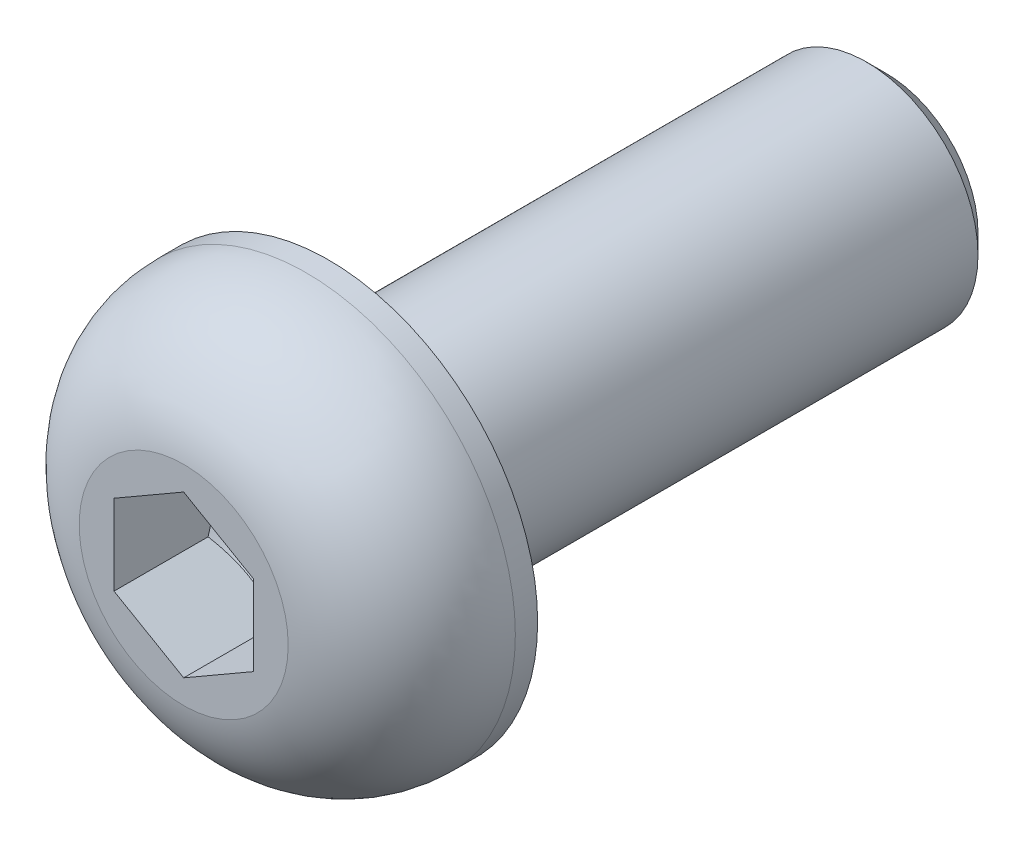
ISO-10303-21;
HEADER;
FILE_DESCRIPTION(('STEP AP214'),'2;1');
FILE_NAME('part.step','',(''),(''),'','','');
FILE_SCHEMA(('AUTOMOTIVE_DESIGN { 1 0 10303 214 1 1 1 1 }'));
ENDSEC;
DATA;
#1=APPLICATION_CONTEXT('core data for automotive mechanical design processes');
#2=APPLICATION_PROTOCOL_DEFINITION('international standard','automotive_design',2000,#1);
#3=PRODUCT_CONTEXT('',#1,'mechanical');
#4=PRODUCT('Part','Part','',(#3));
#5=PRODUCT_RELATED_PRODUCT_CATEGORY('part','',(#4));
#6=PRODUCT_DEFINITION_FORMATION('','',#4);
#7=PRODUCT_DEFINITION_CONTEXT('part definition',#1,'design');
#8=PRODUCT_DEFINITION('design','',#6,#7);
#9=PRODUCT_DEFINITION_SHAPE('','',#8);
#10=(LENGTH_UNIT() NAMED_UNIT(*) SI_UNIT(.MILLI.,.METRE.));
#11=(NAMED_UNIT(*) PLANE_ANGLE_UNIT() SI_UNIT($,.RADIAN.));
#12=(NAMED_UNIT(*) SI_UNIT($,.STERADIAN.) SOLID_ANGLE_UNIT());
#13=UNCERTAINTY_MEASURE_WITH_UNIT(LENGTH_MEASURE(1.E-05),#10,'distance_accuracy_value','');
#14=(GEOMETRIC_REPRESENTATION_CONTEXT(3) GLOBAL_UNCERTAINTY_ASSIGNED_CONTEXT((#13)) GLOBAL_UNIT_ASSIGNED_CONTEXT((#10,
#11,#12)) REPRESENTATION_CONTEXT('',''));
#15=CARTESIAN_POINT('',(0.,0.,0.));
#16=DIRECTION('',(0.,0.,1.));
#17=DIRECTION('',(1.,0.,0.));
#18=AXIS2_PLACEMENT_3D('',#15,#16,#17);
#19=CARTESIAN_POINT('',(0.,1.875,2.6));
#20=DIRECTION('',(0.,0.,-1.));
#21=DIRECTION('',(-1.,0.,0.));
#22=AXIS2_PLACEMENT_3D('',#19,#20,#21);
#23=PLANE('',#22);
#24=CARTESIAN_POINT('',(0.,0.,2.6));
#25=DIRECTION('',(0.,0.,1.));
#26=DIRECTION('',(1.,0.,0.));
#27=AXIS2_PLACEMENT_3D('',#24,#25,#26);
#28=CIRCLE('',#27,1.875);
#29=CARTESIAN_POINT('',(1.875,0.,2.6));
#30=VERTEX_POINT('',#29);
#31=EDGE_CURVE('E141',#30,#30,#28,.T.);
#32=ORIENTED_EDGE('',*,*,#31,.T.);
#33=EDGE_LOOP('',(#32));
#34=FACE_BOUND('',#33,.T.);
#35=DIRECTION('',(-0.866025403784438,-0.5,0.));
#36=VECTOR('',#35,1.);
#37=CARTESIAN_POINT('',(0.,1.44337567297406,2.6));
#38=LINE('',#37,#36);
#39=CARTESIAN_POINT('',(0.,1.44337567297406,2.6));
#40=VERTEX_POINT('',#39);
#41=CARTESIAN_POINT('',(-1.25,0.721687836487031,2.6));
#42=VERTEX_POINT('',#41);
#43=EDGE_CURVE('E93',#40,#42,#38,.T.);
#44=ORIENTED_EDGE('',*,*,#43,.F.);
#45=DIRECTION('',(-0.866025403784439,0.5,0.));
#46=VECTOR('',#45,1.);
#47=CARTESIAN_POINT('',(1.25,0.721687836487032,2.6));
#48=LINE('',#47,#46);
#49=CARTESIAN_POINT('',(1.25,0.721687836487032,2.6));
#50=VERTEX_POINT('',#49);
#51=EDGE_CURVE('E53',#50,#40,#48,.T.);
#52=ORIENTED_EDGE('',*,*,#51,.F.);
#53=DIRECTION('',(0.,1.,0.));
#54=VECTOR('',#53,1.);
#55=CARTESIAN_POINT('',(1.25,-0.721687836487032,2.6));
#56=LINE('',#55,#54);
#57=CARTESIAN_POINT('',(1.25,-0.721687836487032,2.6));
#58=VERTEX_POINT('',#57);
#59=EDGE_CURVE('E121',#58,#50,#56,.T.);
#60=ORIENTED_EDGE('',*,*,#59,.F.);
#61=DIRECTION('',(0.866025403784438,0.5,0.));
#62=VECTOR('',#61,1.);
#63=CARTESIAN_POINT('',(0.,-1.44337567297406,2.6));
#64=LINE('',#63,#62);
#65=CARTESIAN_POINT('',(0.,-1.44337567297406,2.6));
#66=VERTEX_POINT('',#65);
#67=EDGE_CURVE('E115',#66,#58,#64,.T.);
#68=ORIENTED_EDGE('',*,*,#67,.F.);
#69=DIRECTION('',(0.866025403784439,-0.5,0.));
#70=VECTOR('',#69,1.);
#71=CARTESIAN_POINT('',(-1.25,-0.721687836487031,2.6));
#72=LINE('',#71,#70);
#73=CARTESIAN_POINT('',(-1.25,-0.721687836487031,2.6));
#74=VERTEX_POINT('',#73);
#75=EDGE_CURVE('E113',#74,#66,#72,.T.);
#76=ORIENTED_EDGE('',*,*,#75,.F.);
#77=DIRECTION('',(0.,-1.,0.));
#78=VECTOR('',#77,1.);
#79=CARTESIAN_POINT('',(-1.25,0.721687836487031,2.6));
#80=LINE('',#79,#78);
#81=EDGE_CURVE('E101',#42,#74,#80,.T.);
#82=ORIENTED_EDGE('',*,*,#81,.F.);
#83=EDGE_LOOP('',(#44,#52,#60,#68,#76,#82));
#84=FACE_BOUND('',#83,.T.);
#85=ADVANCED_FACE('F38',(#34,#84),#23,.F.);
#86=CARTESIAN_POINT('',(0.,0.,-10.));
#87=DIRECTION('',(0.,0.,1.));
#88=DIRECTION('',(1.,0.,0.));
#89=AXIS2_PLACEMENT_3D('',#86,#87,#88);
#90=PLANE('',#89);
#91=CARTESIAN_POINT('',(0.,0.,-10.));
#92=DIRECTION('',(0.,0.,1.));
#93=DIRECTION('',(1.,0.,0.));
#94=AXIS2_PLACEMENT_3D('',#91,#92,#93);
#95=CIRCLE('',#94,1.64999999999999);
#96=CARTESIAN_POINT('',(1.64999999999999,0.,-10.));
#97=VERTEX_POINT('',#96);
#98=EDGE_CURVE('E232',#97,#97,#95,.F.);
#99=ORIENTED_EDGE('',*,*,#98,.T.);
#100=EDGE_LOOP('',(#99));
#101=FACE_BOUND('',#100,.T.);
#102=ADVANCED_FACE('F210',(#101),#90,.F.);
#103=CARTESIAN_POINT('',(0.,0.,30.8099697885196));
#104=DIRECTION('',(0.,0.,1.));
#105=DIRECTION('',(1.,0.,0.));
#106=AXIS2_PLACEMENT_3D('',#103,#104,#105);
#107=CYLINDRICAL_SURFACE('',#106,2.);
#108=CARTESIAN_POINT('',(0.,0.,-0.199999999999999));
#109=DIRECTION('',(0.,0.,1.));
#110=DIRECTION('',(1.,0.,0.));
#111=AXIS2_PLACEMENT_3D('',#108,#109,#110);
#112=CIRCLE('',#111,2.);
#113=CARTESIAN_POINT('',(2.,0.,-0.199999999999999));
#114=VERTEX_POINT('',#113);
#115=EDGE_CURVE('E11',#114,#114,#112,.F.);
#116=ORIENTED_EDGE('',*,*,#115,.T.);
#117=EDGE_LOOP('',(#116));
#118=FACE_BOUND('',#117,.T.);
#119=CARTESIAN_POINT('',(0.,0.,-9.64999999999999));
#120=DIRECTION('',(0.,0.,1.));
#121=DIRECTION('',(1.,0.,0.));
#122=AXIS2_PLACEMENT_3D('',#119,#120,#121);
#123=CIRCLE('',#122,2.);
#124=CARTESIAN_POINT('',(2.,0.,-9.64999999999999));
#125=VERTEX_POINT('',#124);
#126=EDGE_CURVE('E227',#125,#125,#123,.T.);
#127=ORIENTED_EDGE('',*,*,#126,.T.);
#128=EDGE_LOOP('',(#127));
#129=FACE_BOUND('',#128,.T.);
#130=ADVANCED_FACE('F215',(#118,#129),#107,.T.);
#131=CARTESIAN_POINT('',(0.,2.,0.));
#132=DIRECTION('',(0.,0.,1.));
#133=DIRECTION('',(1.,0.,0.));
#134=AXIS2_PLACEMENT_3D('',#131,#132,#133);
#135=PLANE('',#134);
#136=CARTESIAN_POINT('',(0.,0.,0.));
#137=DIRECTION('',(0.,0.,1.));
#138=DIRECTION('',(1.,0.,0.));
#139=AXIS2_PLACEMENT_3D('',#136,#137,#138);
#140=CIRCLE('',#139,2.2);
#141=CARTESIAN_POINT('',(2.2,0.,0.));
#142=VERTEX_POINT('',#141);
#143=EDGE_CURVE('E46',#142,#142,#140,.T.);
#144=ORIENTED_EDGE('',*,*,#143,.T.);
#145=EDGE_LOOP('',(#144));
#146=FACE_BOUND('',#145,.T.);
#147=CARTESIAN_POINT('',(0.,0.,0.));
#148=DIRECTION('',(0.,0.,1.));
#149=DIRECTION('',(1.,0.,0.));
#150=AXIS2_PLACEMENT_3D('',#147,#148,#149);
#151=CIRCLE('',#150,3.75);
#152=CARTESIAN_POINT('',(3.75,0.,0.));
#153=VERTEX_POINT('',#152);
#154=EDGE_CURVE('E223',#153,#153,#151,.T.);
#155=ORIENTED_EDGE('',*,*,#154,.F.);
#156=EDGE_LOOP('',(#155));
#157=FACE_BOUND('',#156,.T.);
#158=ADVANCED_FACE('F237',(#146,#157),#135,.F.);
#159=CARTESIAN_POINT('',(0.,0.,30.8099697885196));
#160=DIRECTION('',(0.,0.,1.));
#161=DIRECTION('',(1.,0.,0.));
#162=AXIS2_PLACEMENT_3D('',#159,#160,#161);
#163=CYLINDRICAL_SURFACE('',#162,3.75);
#164=CARTESIAN_POINT('',(0.,0.,0.400000000000001));
#165=DIRECTION('',(0.,0.,1.));
#166=DIRECTION('',(1.,0.,0.));
#167=AXIS2_PLACEMENT_3D('',#164,#165,#166);
#168=CIRCLE('',#167,3.75);
#169=CARTESIAN_POINT('',(3.75,0.,0.400000000000001));
#170=VERTEX_POINT('',#169);
#171=EDGE_CURVE('E221',#170,#170,#168,.T.);
#172=ORIENTED_EDGE('',*,*,#171,.F.);
#173=EDGE_LOOP('',(#172));
#174=FACE_BOUND('',#173,.T.);
#175=ORIENTED_EDGE('',*,*,#154,.T.);
#176=EDGE_LOOP('',(#175));
#177=FACE_BOUND('',#176,.T.);
#178=ADVANCED_FACE('F259',(#174,#177),#163,.T.);
#179=CARTESIAN_POINT('',(0.,0.,0.4));
#180=DIRECTION('',(0.,0.,1.));
#181=DIRECTION('',(1.,0.,0.));
#182=AXIS2_PLACEMENT_3D('',#179,#180,#181);
#183=DEGENERATE_TOROIDAL_SURFACE('',#182,1.52183333333333,2.22816666666667,.T.);
#184=ORIENTED_EDGE('',*,*,#31,.F.);
#185=EDGE_LOOP('',(#184));
#186=FACE_BOUND('',#185,.T.);
#187=ORIENTED_EDGE('',*,*,#171,.T.);
#188=EDGE_LOOP('',(#187));
#189=FACE_BOUND('',#188,.T.);
#190=ADVANCED_FACE('F253',(#186,#189),#183,.T.);
#191=CARTESIAN_POINT('',(0.,0.,-9.64999999999999));
#192=DIRECTION('',(0.,0.,1.));
#193=DIRECTION('',(1.,0.,0.));
#194=AXIS2_PLACEMENT_3D('',#191,#192,#193);
#195=CONICAL_SURFACE('',#194,2.,0.785398163397447);
#196=ORIENTED_EDGE('',*,*,#98,.F.);
#197=EDGE_LOOP('',(#196));
#198=FACE_BOUND('',#197,.T.);
#199=ORIENTED_EDGE('',*,*,#126,.F.);
#200=EDGE_LOOP('',(#199));
#201=FACE_BOUND('',#200,.T.);
#202=ADVANCED_FACE('F251',(#198,#201),#195,.T.);
#203=CARTESIAN_POINT('',(1.25,0.721687836487032,-10.001));
#204=DIRECTION('',(0.5,0.866025403784439,0.));
#205=DIRECTION('',(-0.866025403784439,0.5,0.));
#206=AXIS2_PLACEMENT_3D('',#203,#204,#205);
#207=PLANE('',#206);
#208=CARTESIAN_POINT('',(-0.000199999999999732,1.4434911430279,0.91171217151233));
#209=CARTESIAN_POINT('',(0.0547333052317655,1.41177538446487,0.893391411609993));
#210=CARTESIAN_POINT('',(0.11014078650024,1.37978586023939,0.87672880304694));
#211=CARTESIAN_POINT('',(0.22191536760034,1.31525277575269,0.847642800792072));
#212=CARTESIAN_POINT('',(0.278284454841711,1.28270806805991,0.835229698822352));
#213=CARTESIAN_POINT('',(0.390323974086985,1.21802202146378,0.815905184482314));
#214=CARTESIAN_POINT('',(0.445977158459231,1.1858906404852,0.808865186293734));
#215=CARTESIAN_POINT('',(0.557545653908393,1.12147653960455,0.800457929476935));
#216=CARTESIAN_POINT('',(0.613460558937602,1.08919405413422,0.799083712051026));
#217=CARTESIAN_POINT('',(0.717957921181726,1.02886247391297,0.801928834214222));
#218=CARTESIAN_POINT('',(0.766555949881317,1.00080438896118,0.805449595666318));
#219=CARTESIAN_POINT('',(0.863435362173239,0.944871034195503,0.816612609545558));
#220=CARTESIAN_POINT('',(0.911716410192164,0.916995958125019,0.82425868241898));
#221=CARTESIAN_POINT('',(1.00879588385404,0.860947097873546,0.843374951546834));
#222=CARTESIAN_POINT('',(1.0575820103519,0.83278041460729,0.85492625382596));
#223=CARTESIAN_POINT('',(1.1544262522921,0.776867365453649,0.881143811540195));
#224=CARTESIAN_POINT('',(1.20248561032696,0.74912028215514,0.895803898985409));
#225=CARTESIAN_POINT('',(1.2502,0.721572366433195,0.91171217151233));
#226=B_SPLINE_CURVE_WITH_KNOTS('',3,(#208,#209,#210,#211,#212,#213,#214,#215,#216,#217,#218,
#219,#220,#221,#222,#223,#224,#225),.UNSPECIFIED.,.F.,.F.,(4,2,2,2,2,2,2,2,4),(0.,
0.19815082102956,0.396778196315222,0.590488617354401,0.783961049317183,0.952480056398647,
1.1211553973001,1.2935743034359,1.4656542697693),.UNSPECIFIED.);
#227=CARTESIAN_POINT('',(0.,1.44337567297406,0.911645496846304));
#228=VERTEX_POINT('',#227);
#229=CARTESIAN_POINT('',(1.25,0.721687836487032,0.911645496846304));
#230=VERTEX_POINT('',#229);
#231=EDGE_CURVE('E142',#228,#230,#226,.T.);
#232=ORIENTED_EDGE('',*,*,#231,.T.);
#233=DIRECTION('',(0.,0.,1.));
#234=VECTOR('',#233,1.);
#235=CARTESIAN_POINT('',(1.25,0.721687836487032,-10.001));
#236=LINE('',#235,#234);
#237=EDGE_CURVE('E123',#230,#50,#236,.T.);
#238=ORIENTED_EDGE('',*,*,#237,.T.);
#239=ORIENTED_EDGE('',*,*,#51,.T.);
#240=DIRECTION('',(0.,0.,1.));
#241=VECTOR('',#240,1.);
#242=CARTESIAN_POINT('',(0.,1.44337567297406,-10.001));
#243=LINE('',#242,#241);
#244=EDGE_CURVE('E98',#228,#40,#243,.T.);
#245=ORIENTED_EDGE('',*,*,#244,.F.);
#246=EDGE_LOOP('',(#232,#238,#239,#245));
#247=FACE_BOUND('',#246,.T.);
#248=ADVANCED_FACE('F152',(#247),#207,.F.);
#249=CARTESIAN_POINT('',(1.25,-0.721687836487032,-10.001));
#250=DIRECTION('',(1.,0.,0.));
#251=DIRECTION('',(0.,1.,0.));
#252=AXIS2_PLACEMENT_3D('',#249,#250,#251);
#253=PLANE('',#252);
#254=CARTESIAN_POINT('',(1.25,-1.96105474344206,1.42097564912365));
#255=CARTESIAN_POINT('',(1.25,-1.90623430927119,1.39429259623348));
#256=CARTESIAN_POINT('',(1.25,-1.85129028178163,1.36785972321338));
#257=CARTESIAN_POINT('',(1.25,-1.74108952475517,1.31563306560225));
#258=CARTESIAN_POINT('',(1.25,-1.68583274940503,1.2898393777842));
#259=CARTESIAN_POINT('',(1.25,-1.57466736261181,1.23890502395825));
#260=CARTESIAN_POINT('',(1.25,-1.51875685330655,1.21376848119652));
#261=CARTESIAN_POINT('',(1.25,-1.40649796790756,1.16450056450348));
#262=CARTESIAN_POINT('',(1.25,-1.35014961209464,1.14036914434089));
#263=CARTESIAN_POINT('',(1.25,-1.17665045773962,1.0683179276951));
#264=CARTESIAN_POINT('',(1.25,-1.05864305156987,1.02242757330278));
#265=CARTESIAN_POINT('',(1.25,-0.819657773634106,0.939560417752094));
#266=CARTESIAN_POINT('',(1.25,-0.698687180977714,0.90256379802043));
#267=CARTESIAN_POINT('',(1.25,-0.514847741035732,0.858166681636453));
#268=CARTESIAN_POINT('',(1.25,-0.453332207901061,0.845236442395282));
#269=CARTESIAN_POINT('',(1.25,-0.329512056252197,0.823874263664754));
#270=CARTESIAN_POINT('',(1.25,-0.267207531424365,0.815441795135015));
#271=CARTESIAN_POINT('',(1.25,-0.142941091529237,0.80385371506625));
#272=CARTESIAN_POINT('',(1.25,-0.0809858304717168,0.800628689099913));
#273=CARTESIAN_POINT('',(1.25,0.0429730846440799,0.799538151833025));
#274=CARTESIAN_POINT('',(1.25,0.104976740751501,0.801672881331512));
#275=CARTESIAN_POINT('',(1.25,0.252294037554042,0.812929693233274));
#276=CARTESIAN_POINT('',(1.25,0.337427848878579,0.824417508202584));
#277=CARTESIAN_POINT('',(1.25,0.506212079393454,0.855550532557533));
#278=CARTESIAN_POINT('',(1.25,0.589860792939887,0.875204559405284));
#279=CARTESIAN_POINT('',(1.25,0.715099058752615,0.909470753081495));
#280=CARTESIAN_POINT('',(1.25,0.757318989267002,0.921872132798684));
#281=CARTESIAN_POINT('',(1.25,0.841321195262639,0.947999640846473));
#282=CARTESIAN_POINT('',(1.25,0.883103713106104,0.961724987254457));
#283=CARTESIAN_POINT('',(1.25,0.966283159844529,0.990285259833847));
#284=CARTESIAN_POINT('',(1.25,1.0076801028148,1.00512014532189));
#285=CARTESIAN_POINT('',(1.25,1.09013339511368,1.03572121379833));
#286=CARTESIAN_POINT('',(1.25,1.13118969739057,1.0514875230774));
#287=CARTESIAN_POINT('',(1.25,1.26833471364453,1.1056415080992));
#288=CARTESIAN_POINT('',(1.25,1.36373294708307,1.14577705605669));
#289=CARTESIAN_POINT('',(1.25,1.55329254626844,1.22888226735697));
#290=CARTESIAN_POINT('',(1.25,1.64745362339173,1.27185257843871));
#291=CARTESIAN_POINT('',(1.25,1.83491007472554,1.35977053150484));
#292=CARTESIAN_POINT('',(1.25,1.92820492487841,1.40471928663467));
#293=CARTESIAN_POINT('',(1.25,2.11411230875433,1.4960095463212));
#294=CARTESIAN_POINT('',(1.25,2.20672481279689,1.54235111102176));
#295=CARTESIAN_POINT('',(1.25,2.48423466522565,1.68309752552789));
#296=CARTESIAN_POINT('',(1.25,2.66836433611267,1.77901280491505));
#297=CARTESIAN_POINT('',(1.25,3.03534141253052,1.97308363705619));
#298=CARTESIAN_POINT('',(1.25,3.21818926836535,2.07123834561345));
#299=CARTESIAN_POINT('',(1.25,3.55642364131695,2.25453020514237));
#300=CARTESIAN_POINT('',(1.25,3.71191606943591,2.33947211932393));
#301=CARTESIAN_POINT('',(1.25,4.02251221427384,2.51010369110127));
#302=CARTESIAN_POINT('',(1.25,4.17761588538224,2.59579343159282));
#303=CARTESIAN_POINT('',(1.25,4.48685386706873,2.76733439630878));
#304=CARTESIAN_POINT('',(1.25,4.64098946304764,2.85318330530833));
#305=CARTESIAN_POINT('',(1.25,4.94901514609735,3.02527605344198));
#306=CARTESIAN_POINT('',(1.25,5.1029052611118,3.11151984254451));
#307=CARTESIAN_POINT('',(1.25,5.25671599569771,3.19790418061096));
#308=B_SPLINE_CURVE_WITH_KNOTS('',3,(#254,#255,#256,#257,#258,#259,#260,#261,#262,#263,#264,
#265,#266,#267,#268,#269,#270,#271,#272,#273,#274,#275,#276,#277,#278,#279,#280,#281,#282,#283,
#284,#285,#286,#287,#288,#289,#290,#291,#292,#293,#294,#295,#296,#297,#298,#299,#300,#301,#302,
#303,#304,#305,#306,#307),.UNSPECIFIED.,.F.,.F.,(4,2,2,2,2,2,2,2,2,2,2,2,2,2,2,2,2,2,2,2,2,2,2,
2,2,2,4),(0.,0.18290984688699,0.365847219289996,0.54974183185338,0.733627976700977,
1.11331025365342,1.49213844613905,1.68058392586945,1.86900723522428,2.05489751384174,
2.24079614414642,2.49798836542827,2.75545901449846,2.88745299844529,3.01936949975063,
3.15128116645577,3.28321076014453,3.59362061287693,3.904101641108,4.21475964801354,
4.5254310889839,5.14823794575227,5.77081378066878,6.30235308128087,6.83395207039833,
7.36324370393337,7.89247003570512),.UNSPECIFIED.);
#309=CARTESIAN_POINT('',(1.25,-0.721687836487032,0.911645496846304));
#310=VERTEX_POINT('',#309);
#311=EDGE_CURVE('E181',#230,#310,#308,.F.);
#312=ORIENTED_EDGE('',*,*,#311,.T.);
#313=DIRECTION('',(0.,0.,1.));
#314=VECTOR('',#313,1.);
#315=CARTESIAN_POINT('',(1.25,-0.721687836487032,-10.001));
#316=LINE('',#315,#314);
#317=EDGE_CURVE('E125',#310,#58,#316,.T.);
#318=ORIENTED_EDGE('',*,*,#317,.T.);
#319=ORIENTED_EDGE('',*,*,#59,.T.);
#320=ORIENTED_EDGE('',*,*,#237,.F.);
#321=EDGE_LOOP('',(#312,#318,#319,#320));
#322=FACE_BOUND('',#321,.T.);
#323=ADVANCED_FACE('F192',(#322),#253,.F.);
#324=CARTESIAN_POINT('',(0.,-1.44337567297406,-10.001));
#325=DIRECTION('',(0.5,-0.866025403784439,0.));
#326=DIRECTION('',(0.866025403784439,0.5,0.));
#327=AXIS2_PLACEMENT_3D('',#324,#325,#326);
#328=PLANE('',#327);
#329=CARTESIAN_POINT('',(1.2502,-0.721572366433194,0.91171217151233));
#330=CARTESIAN_POINT('',(1.19526669476823,-0.753288124996229,0.893391411609993));
#331=CARTESIAN_POINT('',(1.13985921349976,-0.785277649221703,0.87672880304694));
#332=CARTESIAN_POINT('',(1.02808463239966,-0.849810733708403,0.847642800792072));
#333=CARTESIAN_POINT('',(0.971715545158289,-0.882355441401182,0.835229698822352));
#334=CARTESIAN_POINT('',(0.859676025913015,-0.947041487997317,0.815905184482314));
#335=CARTESIAN_POINT('',(0.80402284154077,-0.979172868975893,0.808865186293734));
#336=CARTESIAN_POINT('',(0.692454346091608,-1.04358696985655,0.800457929476935));
#337=CARTESIAN_POINT('',(0.636539441062399,-1.07586945532687,0.799083712051026));
#338=CARTESIAN_POINT('',(0.532042078818274,-1.13620103554813,0.801928834214222));
#339=CARTESIAN_POINT('',(0.483444050118684,-1.16425912049992,0.805449595666318));
#340=CARTESIAN_POINT('',(0.386564637826762,-1.22019247526559,0.816612609545559));
#341=CARTESIAN_POINT('',(0.338283589807837,-1.24806755133608,0.82425868241898));
#342=CARTESIAN_POINT('',(0.241204116145957,-1.30411641158755,0.843374951546834));
#343=CARTESIAN_POINT('',(0.192417989648101,-1.33228309485381,0.85492625382596));
#344=CARTESIAN_POINT('',(0.0955737477078991,-1.38819614400745,0.881143811540195));
#345=CARTESIAN_POINT('',(0.0475143896730371,-1.41594322730596,0.895803898985409));
#346=CARTESIAN_POINT('',(-0.00019999999999849,-1.4434911430279,0.91171217151233));
#347=B_SPLINE_CURVE_WITH_KNOTS('',3,(#329,#330,#331,#332,#333,#334,#335,#336,#337,#338,#339,
#340,#341,#342,#343,#344,#345,#346),.UNSPECIFIED.,.F.,.F.,(4,2,2,2,2,2,2,2,4),(0.,
0.19815082102956,0.396778196315222,0.590488617354401,0.783961049317183,0.952480056398647,
1.1211553973001,1.2935743034359,1.4656542697693),.UNSPECIFIED.);
#348=CARTESIAN_POINT('',(0.,-1.44337567297406,0.911645496846304));
#349=VERTEX_POINT('',#348);
#350=EDGE_CURVE('E174',#310,#349,#347,.T.);
#351=ORIENTED_EDGE('',*,*,#350,.T.);
#352=DIRECTION('',(0.,0.,1.));
#353=VECTOR('',#352,1.);
#354=CARTESIAN_POINT('',(0.,-1.44337567297406,-10.001));
#355=LINE('',#354,#353);
#356=EDGE_CURVE('E128',#349,#66,#355,.T.);
#357=ORIENTED_EDGE('',*,*,#356,.T.);
#358=ORIENTED_EDGE('',*,*,#67,.T.);
#359=ORIENTED_EDGE('',*,*,#317,.F.);
#360=EDGE_LOOP('',(#351,#357,#358,#359));
#361=FACE_BOUND('',#360,.T.);
#362=ADVANCED_FACE('F195',(#361),#328,.F.);
#363=CARTESIAN_POINT('',(-1.25,-0.721687836487031,-10.001));
#364=DIRECTION('',(-0.5,-0.866025403784439,0.));
#365=DIRECTION('',(0.866025403784439,-0.5,0.));
#366=AXIS2_PLACEMENT_3D('',#363,#364,#365);
#367=PLANE('',#366);
#368=CARTESIAN_POINT('',(0.000200000000001301,-1.4434911430279,0.91171217151233));
#369=CARTESIAN_POINT('',(-0.0547333052317639,-1.41177538446487,0.893391411609993));
#370=CARTESIAN_POINT('',(-0.110140786500239,-1.37978586023939,0.87672880304694));
#371=CARTESIAN_POINT('',(-0.221915367600339,-1.31525277575269,0.847642800792072));
#372=CARTESIAN_POINT('',(-0.278284454841709,-1.28270806805991,0.835229698822352));
#373=CARTESIAN_POINT('',(-0.390323974086984,-1.21802202146378,0.815905184482314));
#374=CARTESIAN_POINT('',(-0.445977158459229,-1.1858906404852,0.808865186293734));
#375=CARTESIAN_POINT('',(-0.557545653908391,-1.12147653960455,0.800457929476935));
#376=CARTESIAN_POINT('',(-0.6134605589376,-1.08919405413422,0.799083712051026));
#377=CARTESIAN_POINT('',(-0.717957921181725,-1.02886247391297,0.801928834214222));
#378=CARTESIAN_POINT('',(-0.766555949881315,-1.00080438896118,0.805449595666317));
#379=CARTESIAN_POINT('',(-0.863435362173238,-0.944871034195503,0.816612609545558));
#380=CARTESIAN_POINT('',(-0.911716410192163,-0.916995958125019,0.824258682418979));
#381=CARTESIAN_POINT('',(-1.00879588385404,-0.860947097873546,0.843374951546834));
#382=CARTESIAN_POINT('',(-1.0575820103519,-0.832780414607289,0.85492625382596));
#383=CARTESIAN_POINT('',(-1.1544262522921,-0.776867365453648,0.881143811540195));
#384=CARTESIAN_POINT('',(-1.20248561032696,-0.74912028215514,0.895803898985409));
#385=CARTESIAN_POINT('',(-1.2502,-0.721572366433194,0.91171217151233));
#386=B_SPLINE_CURVE_WITH_KNOTS('',3,(#368,#369,#370,#371,#372,#373,#374,#375,#376,#377,#378,
#379,#380,#381,#382,#383,#384,#385),.UNSPECIFIED.,.F.,.F.,(4,2,2,2,2,2,2,2,4),(0.,
0.19815082102956,0.396778196315222,0.590488617354401,0.783961049317183,0.952480056398647,
1.1211553973001,1.2935743034359,1.46565426976931),.UNSPECIFIED.);
#387=CARTESIAN_POINT('',(-1.25,-0.721687836487111,0.911645496846251));
#388=VERTEX_POINT('',#387);
#389=EDGE_CURVE('E167',#349,#388,#386,.T.);
#390=ORIENTED_EDGE('',*,*,#389,.T.);
#391=DIRECTION('',(0.,0.,1.));
#392=VECTOR('',#391,1.);
#393=CARTESIAN_POINT('',(-1.25,-0.721687836487031,-10.001));
#394=LINE('',#393,#392);
#395=EDGE_CURVE('E109',#388,#74,#394,.T.);
#396=ORIENTED_EDGE('',*,*,#395,.T.);
#397=ORIENTED_EDGE('',*,*,#75,.T.);
#398=ORIENTED_EDGE('',*,*,#356,.F.);
#399=EDGE_LOOP('',(#390,#396,#397,#398));
#400=FACE_BOUND('',#399,.T.);
#401=ADVANCED_FACE('F199',(#400),#367,.F.);
#402=CARTESIAN_POINT('',(-1.25,0.721687836487031,-10.001));
#403=DIRECTION('',(-1.,0.,0.));
#404=DIRECTION('',(0.,-1.,0.));
#405=AXIS2_PLACEMENT_3D('',#402,#403,#404);
#406=PLANE('',#405);
#407=CARTESIAN_POINT('',(-1.25,-1.96105474344206,1.42097564912365));
#408=CARTESIAN_POINT('',(-1.25,-1.90623430927119,1.39429259623348));
#409=CARTESIAN_POINT('',(-1.25,-1.85129028178163,1.36785972321338));
#410=CARTESIAN_POINT('',(-1.25,-1.74108952475517,1.31563306560225));
#411=CARTESIAN_POINT('',(-1.25,-1.68583274940503,1.2898393777842));
#412=CARTESIAN_POINT('',(-1.25,-1.57466736261181,1.23890502395825));
#413=CARTESIAN_POINT('',(-1.25,-1.51875685330655,1.21376848119652));
#414=CARTESIAN_POINT('',(-1.25,-1.40649796790756,1.16450056450348));
#415=CARTESIAN_POINT('',(-1.25,-1.35014961209464,1.14036914434089));
#416=CARTESIAN_POINT('',(-1.25,-1.17665045773962,1.0683179276951));
#417=CARTESIAN_POINT('',(-1.25,-1.05864305156987,1.02242757330278));
#418=CARTESIAN_POINT('',(-1.25,-0.819657773634105,0.939560417752094));
#419=CARTESIAN_POINT('',(-1.25,-0.698687180977713,0.90256379802043));
#420=CARTESIAN_POINT('',(-1.25,-0.514847741035731,0.858166681636453));
#421=CARTESIAN_POINT('',(-1.25,-0.45333220790106,0.845236442395282));
#422=CARTESIAN_POINT('',(-1.25,-0.329512056252196,0.823874263664755));
#423=CARTESIAN_POINT('',(-1.25,-0.267207531424364,0.815441795135015));
#424=CARTESIAN_POINT('',(-1.25,-0.142941091529236,0.80385371506625));
#425=CARTESIAN_POINT('',(-1.25,-0.0809858304717161,0.800628689099913));
#426=CARTESIAN_POINT('',(-1.25,0.0429730846440806,0.799538151833026));
#427=CARTESIAN_POINT('',(-1.25,0.104976740751501,0.801672881331513));
#428=CARTESIAN_POINT('',(-1.25,0.252294037554043,0.812929693233274));
#429=CARTESIAN_POINT('',(-1.25,0.33742784887858,0.824417508202584));
#430=CARTESIAN_POINT('',(-1.25,0.506212079393455,0.855550532557534));
#431=CARTESIAN_POINT('',(-1.25,0.589860792939888,0.875204559405285));
#432=CARTESIAN_POINT('',(-1.25,0.715099058752616,0.909470753081496));
#433=CARTESIAN_POINT('',(-1.25,0.757318989267003,0.921872132798685));
#434=CARTESIAN_POINT('',(-1.25,0.841321195262641,0.947999640846473));
#435=CARTESIAN_POINT('',(-1.25,0.883103713106105,0.961724987254457));
#436=CARTESIAN_POINT('',(-1.25,0.96628315984453,0.990285259833848));
#437=CARTESIAN_POINT('',(-1.25,1.0076801028148,1.0051201453219));
#438=CARTESIAN_POINT('',(-1.25,1.09013339511368,1.03572121379833));
#439=CARTESIAN_POINT('',(-1.25,1.13118969739057,1.0514875230774));
#440=CARTESIAN_POINT('',(-1.25,1.26833471364453,1.1056415080992));
#441=CARTESIAN_POINT('',(-1.25,1.36373294708307,1.14577705605669));
#442=CARTESIAN_POINT('',(-1.25,1.55329254626844,1.22888226735697));
#443=CARTESIAN_POINT('',(-1.25,1.64745362339173,1.27185257843871));
#444=CARTESIAN_POINT('',(-1.25,1.83491007472554,1.35977053150484));
#445=CARTESIAN_POINT('',(-1.25,1.92820492487841,1.40471928663467));
#446=CARTESIAN_POINT('',(-1.25,2.11411230875433,1.4960095463212));
#447=CARTESIAN_POINT('',(-1.25,2.20672481279689,1.54235111102176));
#448=CARTESIAN_POINT('',(-1.25,2.48423466522565,1.6830975255279));
#449=CARTESIAN_POINT('',(-1.25,2.66836433611267,1.77901280491505));
#450=CARTESIAN_POINT('',(-1.25,3.03534141253052,1.97308363705619));
#451=CARTESIAN_POINT('',(-1.25,3.21818926836536,2.07123834561346));
#452=CARTESIAN_POINT('',(-1.25,3.55642364131696,2.25453020514237));
#453=CARTESIAN_POINT('',(-1.25,3.71191606943591,2.33947211932393));
#454=CARTESIAN_POINT('',(-1.25,4.02251221427385,2.51010369110127));
#455=CARTESIAN_POINT('',(-1.25,4.17761588538225,2.59579343159282));
#456=CARTESIAN_POINT('',(-1.25,4.48685386706873,2.76733439630878));
#457=CARTESIAN_POINT('',(-1.25,4.64098946304765,2.85318330530833));
#458=CARTESIAN_POINT('',(-1.25,4.94901514609736,3.02527605344198));
#459=CARTESIAN_POINT('',(-1.25,5.10290526111181,3.11151984254452));
#460=CARTESIAN_POINT('',(-1.25,5.25671599569771,3.19790418061097));
#461=B_SPLINE_CURVE_WITH_KNOTS('',3,(#407,#408,#409,#410,#411,#412,#413,#414,#415,#416,#417,
#418,#419,#420,#421,#422,#423,#424,#425,#426,#427,#428,#429,#430,#431,#432,#433,#434,#435,#436,
#437,#438,#439,#440,#441,#442,#443,#444,#445,#446,#447,#448,#449,#450,#451,#452,#453,#454,#455,
#456,#457,#458,#459,#460),.UNSPECIFIED.,.F.,.F.,(4,2,2,2,2,2,2,2,2,2,2,2,2,2,2,2,2,2,2,2,2,2,2,
2,2,2,4),(0.,0.18290984688699,0.365847219289996,0.54974183185338,0.733627976700978,
1.11331025365342,1.49213844613905,1.68058392586945,1.86900723522429,2.05489751384174,
2.24079614414642,2.49798836542827,2.75545901449846,2.88745299844529,3.01936949975063,
3.15128116645577,3.28321076014453,3.59362061287693,3.904101641108,4.21475964801354,
4.5254310889839,5.14823794575228,5.77081378066878,6.30235308128087,6.83395207039833,
7.36324370393338,7.89247003570513),.UNSPECIFIED.);
#462=CARTESIAN_POINT('',(-1.25,0.721687836487031,0.911645496846304));
#463=VERTEX_POINT('',#462);
#464=EDGE_CURVE('E108',#388,#463,#461,.T.);
#465=ORIENTED_EDGE('',*,*,#464,.T.);
#466=DIRECTION('',(0.,0.,1.));
#467=VECTOR('',#466,1.);
#468=CARTESIAN_POINT('',(-1.25,0.721687836487031,-10.001));
#469=LINE('',#468,#467);
#470=EDGE_CURVE('E97',#463,#42,#469,.T.);
#471=ORIENTED_EDGE('',*,*,#470,.T.);
#472=ORIENTED_EDGE('',*,*,#81,.T.);
#473=ORIENTED_EDGE('',*,*,#395,.F.);
#474=EDGE_LOOP('',(#465,#471,#472,#473));
#475=FACE_BOUND('',#474,.T.);
#476=ADVANCED_FACE('F105',(#475),#406,.F.);
#477=CARTESIAN_POINT('',(0.,1.44337567297406,-10.001));
#478=DIRECTION('',(-0.500000000000001,0.866025403784438,0.));
#479=DIRECTION('',(-0.866025403784438,-0.500000000000001,0.));
#480=AXIS2_PLACEMENT_3D('',#477,#478,#479);
#481=PLANE('',#480);
#482=CARTESIAN_POINT('',(-1.2502,0.721572366433193,0.91171217151233));
#483=CARTESIAN_POINT('',(-1.19526669476823,0.753288124996228,0.893391411609993));
#484=CARTESIAN_POINT('',(-1.13985921349976,0.785277649221701,0.87672880304694));
#485=CARTESIAN_POINT('',(-1.02808463239966,0.849810733708402,0.847642800792072));
#486=CARTESIAN_POINT('',(-0.971715545158289,0.882355441401181,0.835229698822352));
#487=CARTESIAN_POINT('',(-0.859676025913015,0.947041487997316,0.815905184482314));
#488=CARTESIAN_POINT('',(-0.80402284154077,0.979172868975892,0.808865186293734));
#489=CARTESIAN_POINT('',(-0.692454346091608,1.04358696985655,0.800457929476935));
#490=CARTESIAN_POINT('',(-0.636539441062399,1.07586945532687,0.799083712051026));
#491=CARTESIAN_POINT('',(-0.532042078818275,1.13620103554812,0.801928834214222));
#492=CARTESIAN_POINT('',(-0.483444050118684,1.16425912049992,0.805449595666317));
#493=CARTESIAN_POINT('',(-0.386564637826761,1.22019247526559,0.816612609545558));
#494=CARTESIAN_POINT('',(-0.338283589807836,1.24806755133608,0.824258682418979));
#495=CARTESIAN_POINT('',(-0.241204116145956,1.30411641158755,0.843374951546834));
#496=CARTESIAN_POINT('',(-0.1924179896481,1.33228309485381,0.85492625382596));
#497=CARTESIAN_POINT('',(-0.0955737477078976,1.38819614400745,0.881143811540195));
#498=CARTESIAN_POINT('',(-0.0475143896730355,1.41594322730596,0.895803898985409));
#499=CARTESIAN_POINT('',(0.000200000000000196,1.4434911430279,0.91171217151233));
#500=B_SPLINE_CURVE_WITH_KNOTS('',3,(#482,#483,#484,#485,#486,#487,#488,#489,#490,#491,#492,
#493,#494,#495,#496,#497,#498,#499),.UNSPECIFIED.,.F.,.F.,(4,2,2,2,2,2,2,2,4),(0.,
0.19815082102956,0.396778196315222,0.590488617354401,0.783961049317183,0.952480056398647,
1.1211553973001,1.2935743034359,1.4656542697693),.UNSPECIFIED.);
#501=EDGE_CURVE('E133',#463,#228,#500,.T.);
#502=ORIENTED_EDGE('',*,*,#501,.T.);
#503=ORIENTED_EDGE('',*,*,#244,.T.);
#504=ORIENTED_EDGE('',*,*,#43,.T.);
#505=ORIENTED_EDGE('',*,*,#470,.F.);
#506=EDGE_LOOP('',(#502,#503,#504,#505));
#507=FACE_BOUND('',#506,.T.);
#508=ADVANCED_FACE('F96',(#507),#481,.F.);
#509=CARTESIAN_POINT('',(0.,0.,0.0783121635129615));
#510=DIRECTION('',(0.,0.,1.));
#511=DIRECTION('',(1.,0.,0.));
#512=AXIS2_PLACEMENT_3D('',#509,#510,#511);
#513=CONICAL_SURFACE('',#512,0.,1.04719755119659);
#514=ORIENTED_EDGE('',*,*,#350,.F.);
#515=ORIENTED_EDGE('',*,*,#311,.F.);
#516=ORIENTED_EDGE('',*,*,#231,.F.);
#517=ORIENTED_EDGE('',*,*,#501,.F.);
#518=ORIENTED_EDGE('',*,*,#464,.F.);
#519=ORIENTED_EDGE('',*,*,#389,.F.);
#520=EDGE_LOOP('',(#514,#515,#516,#517,#518,#519));
#521=FACE_BOUND('',#520,.T.);
#522=CARTESIAN_POINT('',(0.,0.,0.0783121635129613));
#523=VERTEX_POINT('',#522);
#524=VERTEX_LOOP('',#523);
#525=FACE_BOUND('',#524,.T.);
#526=ADVANCED_FACE('F147',(#521,#525),#513,.F.);
#527=CARTESIAN_POINT('',(0.,0.,-0.199999999999999));
#528=DIRECTION('',(0.,0.,1.));
#529=DIRECTION('',(1.,0.,0.));
#530=AXIS2_PLACEMENT_3D('',#527,#528,#529);
#531=TOROIDAL_SURFACE('',#530,2.2,0.2);
#532=ORIENTED_EDGE('',*,*,#115,.F.);
#533=EDGE_LOOP('',(#532));
#534=FACE_BOUND('',#533,.T.);
#535=ORIENTED_EDGE('',*,*,#143,.F.);
#536=EDGE_LOOP('',(#535));
#537=FACE_BOUND('',#536,.T.);
#538=ADVANCED_FACE('F40',(#534,#537),#531,.F.);
#539=CLOSED_SHELL('',(#85,#102,#130,#158,#178,#190,#202,#248,#323,#362,#401,#476,#508,#526,#538));
#540=MANIFOLD_SOLID_BREP('B2',#539);
#541=ADVANCED_BREP_SHAPE_REPRESENTATION('',(#18,#540),#14);
#542=SHAPE_DEFINITION_REPRESENTATION(#9,#541);
ENDSEC;
END-ISO-10303-21;
